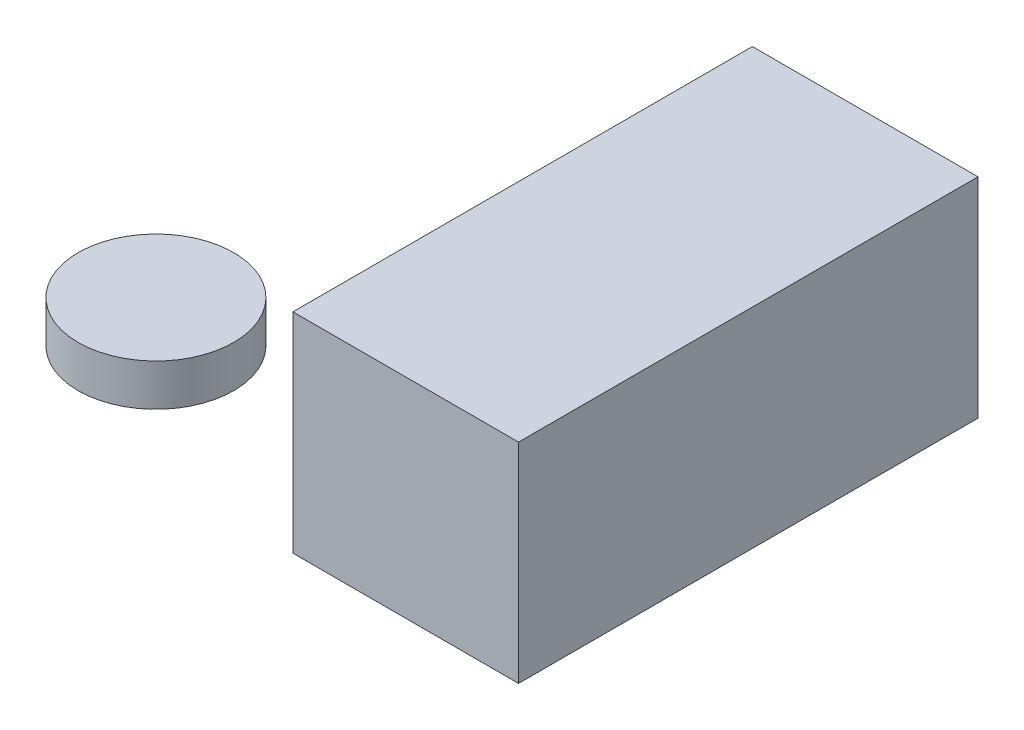
ISO-10303-21;
HEADER;
FILE_DESCRIPTION(('STEP AP214'),'2;1');
FILE_NAME('part.step','',(''),(''),'','','');
FILE_SCHEMA(('AUTOMOTIVE_DESIGN { 1 0 10303 214 1 1 1 1 }'));
ENDSEC;
DATA;
#1=APPLICATION_CONTEXT('core data for automotive mechanical design processes');
#2=APPLICATION_PROTOCOL_DEFINITION('international standard','automotive_design',2000,#1);
#3=PRODUCT_CONTEXT('',#1,'mechanical');
#4=PRODUCT('Part','Part','',(#3));
#5=PRODUCT_RELATED_PRODUCT_CATEGORY('part','',(#4));
#6=PRODUCT_DEFINITION_FORMATION('','',#4);
#7=PRODUCT_DEFINITION_CONTEXT('part definition',#1,'design');
#8=PRODUCT_DEFINITION('design','',#6,#7);
#9=PRODUCT_DEFINITION_SHAPE('','',#8);
#10=(LENGTH_UNIT() NAMED_UNIT(*) SI_UNIT(.MILLI.,.METRE.));
#11=(NAMED_UNIT(*) PLANE_ANGLE_UNIT() SI_UNIT($,.RADIAN.));
#12=(NAMED_UNIT(*) SI_UNIT($,.STERADIAN.) SOLID_ANGLE_UNIT());
#13=UNCERTAINTY_MEASURE_WITH_UNIT(LENGTH_MEASURE(1.E-05),#10,'distance_accuracy_value','');
#14=(GEOMETRIC_REPRESENTATION_CONTEXT(3) GLOBAL_UNCERTAINTY_ASSIGNED_CONTEXT((#13)) GLOBAL_UNIT_ASSIGNED_CONTEXT((#10,
#11,#12)) REPRESENTATION_CONTEXT('',''));
#15=CARTESIAN_POINT('',(0.,0.,0.));
#16=DIRECTION('',(0.,0.,1.));
#17=DIRECTION('',(1.,0.,0.));
#18=AXIS2_PLACEMENT_3D('',#15,#16,#17);
#19=CARTESIAN_POINT('',(-86.3368433832069,10.,28.3773931689706));
#20=DIRECTION('',(0.,-1.,0.));
#21=DIRECTION('',(0.,0.,-1.));
#22=AXIS2_PLACEMENT_3D('',#19,#20,#21);
#23=CYLINDRICAL_SURFACE('',#22,18.6142975154497);
#24=CARTESIAN_POINT('',(-86.3368433832069,10.,28.3773931689706));
#25=DIRECTION('',(0.,1.,0.));
#26=DIRECTION('',(0.,0.,1.));
#27=AXIS2_PLACEMENT_3D('',#24,#25,#26);
#28=CIRCLE('',#27,18.6142975154497);
#29=CARTESIAN_POINT('',(-86.3368433832069,10.,46.9916906844203));
#30=VERTEX_POINT('',#29);
#31=EDGE_CURVE('E11',#30,#30,#28,.T.);
#32=ORIENTED_EDGE('',*,*,#31,.F.);
#33=EDGE_LOOP('',(#32));
#34=FACE_BOUND('',#33,.T.);
#35=CARTESIAN_POINT('',(-86.3368433832069,0.,28.3773931689706));
#36=DIRECTION('',(0.,1.,0.));
#37=DIRECTION('',(0.,0.,1.));
#38=AXIS2_PLACEMENT_3D('',#35,#36,#37);
#39=CIRCLE('',#38,18.6142975154497);
#40=CARTESIAN_POINT('',(-86.3368433832069,0.,46.9916906844203));
#41=VERTEX_POINT('',#40);
#42=EDGE_CURVE('E51',#41,#41,#39,.T.);
#43=ORIENTED_EDGE('',*,*,#42,.T.);
#44=EDGE_LOOP('',(#43));
#45=FACE_BOUND('',#44,.T.);
#46=ADVANCED_FACE('F48',(#34,#45),#23,.T.);
#47=CARTESIAN_POINT('',(-86.3368433832069,10.,28.3773931689706));
#48=DIRECTION('',(0.,1.,0.));
#49=DIRECTION('',(0.,0.,1.));
#50=AXIS2_PLACEMENT_3D('',#47,#48,#49);
#51=PLANE('',#50);
#52=ORIENTED_EDGE('',*,*,#31,.T.);
#53=EDGE_LOOP('',(#52));
#54=FACE_BOUND('',#53,.T.);
#55=ADVANCED_FACE('F63',(#54),#51,.T.);
#56=CARTESIAN_POINT('',(-86.3368433832069,0.,28.3773931689706));
#57=DIRECTION('',(0.,1.,0.));
#58=DIRECTION('',(0.,0.,1.));
#59=AXIS2_PLACEMENT_3D('',#56,#57,#58);
#60=PLANE('',#59);
#61=ORIENTED_EDGE('',*,*,#42,.F.);
#62=EDGE_LOOP('',(#61));
#63=FACE_BOUND('',#62,.T.);
#64=ADVANCED_FACE('F61',(#63),#60,.F.);
#65=CLOSED_SHELL('',(#46,#55,#64));
#66=MANIFOLD_SOLID_BREP('B2',#65);
#67=CARTESIAN_POINT('',(-56.9852326353717,10.,0.));
#68=DIRECTION('',(0.,-1.,0.));
#69=DIRECTION('',(0.,0.,-1.));
#70=AXIS2_PLACEMENT_3D('',#67,#68,#69);
#71=CYLINDRICAL_SURFACE('',#70,5.);
#72=CARTESIAN_POINT('',(-56.9852326353717,10.,0.));
#73=DIRECTION('',(0.,1.,0.));
#74=DIRECTION('',(0.,0.,1.));
#75=AXIS2_PLACEMENT_3D('',#72,#73,#74);
#76=CIRCLE('',#75,5.);
#77=CARTESIAN_POINT('',(-56.9852326353717,10.,5.));
#78=VERTEX_POINT('',#77);
#79=EDGE_CURVE('E47',#78,#78,#76,.T.);
#80=ORIENTED_EDGE('',*,*,#79,.F.);
#81=EDGE_LOOP('',(#80));
#82=FACE_BOUND('',#81,.T.);
#83=CARTESIAN_POINT('',(-56.9852326353717,0.,0.));
#84=DIRECTION('',(0.,1.,0.));
#85=DIRECTION('',(0.,0.,1.));
#86=AXIS2_PLACEMENT_3D('',#83,#84,#85);
#87=CIRCLE('',#86,5.);
#88=CARTESIAN_POINT('',(-56.9852326353717,0.,5.));
#89=VERTEX_POINT('',#88);
#90=EDGE_CURVE('E101',#89,#89,#87,.T.);
#91=ORIENTED_EDGE('',*,*,#90,.T.);
#92=EDGE_LOOP('',(#91));
#93=FACE_BOUND('',#92,.T.);
#94=ADVANCED_FACE('F98',(#82,#93),#71,.T.);
#95=CARTESIAN_POINT('',(-56.9852326353717,10.,0.));
#96=DIRECTION('',(0.,1.,0.));
#97=DIRECTION('',(0.,0.,1.));
#98=AXIS2_PLACEMENT_3D('',#95,#96,#97);
#99=PLANE('',#98);
#100=ORIENTED_EDGE('',*,*,#79,.T.);
#101=EDGE_LOOP('',(#100));
#102=FACE_BOUND('',#101,.T.);
#103=ADVANCED_FACE('F113',(#102),#99,.T.);
#104=CARTESIAN_POINT('',(-56.9852326353717,0.,0.));
#105=DIRECTION('',(0.,1.,0.));
#106=DIRECTION('',(0.,0.,1.));
#107=AXIS2_PLACEMENT_3D('',#104,#105,#106);
#108=PLANE('',#107);
#109=ORIENTED_EDGE('',*,*,#90,.F.);
#110=EDGE_LOOP('',(#109));
#111=FACE_BOUND('',#110,.T.);
#112=ADVANCED_FACE('F111',(#111),#108,.F.);
#113=CLOSED_SHELL('',(#94,#103,#112));
#114=MANIFOLD_SOLID_BREP('B6',#113);
#115=CARTESIAN_POINT('',(26.9852326353717,50.,54.956563421413));
#116=DIRECTION('',(-1.,0.,0.));
#117=DIRECTION('',(0.,0.,1.));
#118=AXIS2_PLACEMENT_3D('',#115,#116,#117);
#119=PLANE('',#118);
#120=DIRECTION('',(0.,0.,-1.));
#121=VECTOR('',#120,1.);
#122=CARTESIAN_POINT('',(26.9852326353717,0.,54.956563421413));
#123=LINE('',#122,#121);
#124=CARTESIAN_POINT('',(26.9852326353717,0.,54.956563421413));
#125=VERTEX_POINT('',#124);
#126=CARTESIAN_POINT('',(26.9852326353717,0.,-54.956563421413));
#127=VERTEX_POINT('',#126);
#128=EDGE_CURVE('E210',#125,#127,#123,.T.);
#129=ORIENTED_EDGE('',*,*,#128,.T.);
#130=DIRECTION('',(0.,-1.,0.));
#131=VECTOR('',#130,1.);
#132=CARTESIAN_POINT('',(26.9852326353717,50.,-54.956563421413));
#133=LINE('',#132,#131);
#134=CARTESIAN_POINT('',(26.9852326353717,50.,-54.956563421413));
#135=VERTEX_POINT('',#134);
#136=EDGE_CURVE('E96',#135,#127,#133,.T.);
#137=ORIENTED_EDGE('',*,*,#136,.F.);
#138=DIRECTION('',(0.,0.,-1.));
#139=VECTOR('',#138,1.);
#140=CARTESIAN_POINT('',(26.9852326353717,50.,54.956563421413));
#141=LINE('',#140,#139);
#142=CARTESIAN_POINT('',(26.9852326353717,50.,54.956563421413));
#143=VERTEX_POINT('',#142);
#144=EDGE_CURVE('E198',#143,#135,#141,.T.);
#145=ORIENTED_EDGE('',*,*,#144,.F.);
#146=DIRECTION('',(0.,-1.,0.));
#147=VECTOR('',#146,1.);
#148=CARTESIAN_POINT('',(26.9852326353717,50.,54.956563421413));
#149=LINE('',#148,#147);
#150=EDGE_CURVE('E206',#143,#125,#149,.T.);
#151=ORIENTED_EDGE('',*,*,#150,.T.);
#152=EDGE_LOOP('',(#129,#137,#145,#151));
#153=FACE_BOUND('',#152,.T.);
#154=ADVANCED_FACE('F147',(#153),#119,.F.);
#155=CARTESIAN_POINT('',(-26.9852326353717,50.,-54.956563421413));
#156=DIRECTION('',(0.,0.,1.));
#157=DIRECTION('',(1.,0.,0.));
#158=AXIS2_PLACEMENT_3D('',#155,#156,#157);
#159=PLANE('',#158);
#160=DIRECTION('',(-1.,0.,0.));
#161=VECTOR('',#160,1.);
#162=CARTESIAN_POINT('',(-26.9852326353717,0.,-54.956563421413));
#163=LINE('',#162,#161);
#164=CARTESIAN_POINT('',(-26.9852326353717,0.,-54.956563421413));
#165=VERTEX_POINT('',#164);
#166=EDGE_CURVE('E202',#127,#165,#163,.T.);
#167=ORIENTED_EDGE('',*,*,#166,.T.);
#168=DIRECTION('',(0.,-1.,0.));
#169=VECTOR('',#168,1.);
#170=CARTESIAN_POINT('',(-26.9852326353717,50.,-54.956563421413));
#171=LINE('',#170,#169);
#172=CARTESIAN_POINT('',(-26.9852326353717,50.,-54.956563421413));
#173=VERTEX_POINT('',#172);
#174=EDGE_CURVE('E155',#173,#165,#171,.T.);
#175=ORIENTED_EDGE('',*,*,#174,.F.);
#176=DIRECTION('',(-1.,0.,0.));
#177=VECTOR('',#176,1.);
#178=CARTESIAN_POINT('',(-26.9852326353717,50.,-54.956563421413));
#179=LINE('',#178,#177);
#180=EDGE_CURVE('E193',#135,#173,#179,.T.);
#181=ORIENTED_EDGE('',*,*,#180,.F.);
#182=ORIENTED_EDGE('',*,*,#136,.T.);
#183=EDGE_LOOP('',(#167,#175,#181,#182));
#184=FACE_BOUND('',#183,.T.);
#185=ADVANCED_FACE('F201',(#184),#159,.F.);
#186=CARTESIAN_POINT('',(-26.9852326353717,50.,54.956563421413));
#187=DIRECTION('',(1.,0.,0.));
#188=DIRECTION('',(0.,0.,-1.));
#189=AXIS2_PLACEMENT_3D('',#186,#187,#188);
#190=PLANE('',#189);
#191=DIRECTION('',(0.,0.,1.));
#192=VECTOR('',#191,1.);
#193=CARTESIAN_POINT('',(-26.9852326353717,0.,54.956563421413));
#194=LINE('',#193,#192);
#195=CARTESIAN_POINT('',(-26.9852326353717,0.,54.956563421413));
#196=VERTEX_POINT('',#195);
#197=EDGE_CURVE('E180',#165,#196,#194,.T.);
#198=ORIENTED_EDGE('',*,*,#197,.T.);
#199=DIRECTION('',(0.,-1.,0.));
#200=VECTOR('',#199,1.);
#201=CARTESIAN_POINT('',(-26.9852326353717,50.,54.956563421413));
#202=LINE('',#201,#200);
#203=CARTESIAN_POINT('',(-26.9852326353717,50.,54.956563421413));
#204=VERTEX_POINT('',#203);
#205=EDGE_CURVE('E203',#204,#196,#202,.T.);
#206=ORIENTED_EDGE('',*,*,#205,.F.);
#207=DIRECTION('',(0.,0.,1.));
#208=VECTOR('',#207,1.);
#209=CARTESIAN_POINT('',(-26.9852326353717,50.,54.956563421413));
#210=LINE('',#209,#208);
#211=EDGE_CURVE('E196',#173,#204,#210,.T.);
#212=ORIENTED_EDGE('',*,*,#211,.F.);
#213=ORIENTED_EDGE('',*,*,#174,.T.);
#214=EDGE_LOOP('',(#198,#206,#212,#213));
#215=FACE_BOUND('',#214,.T.);
#216=ADVANCED_FACE('F204',(#215),#190,.F.);
#217=CARTESIAN_POINT('',(-26.9852326353717,50.,54.956563421413));
#218=DIRECTION('',(0.,0.,-1.));
#219=DIRECTION('',(-1.,0.,0.));
#220=AXIS2_PLACEMENT_3D('',#217,#218,#219);
#221=PLANE('',#220);
#222=DIRECTION('',(1.,0.,0.));
#223=VECTOR('',#222,1.);
#224=CARTESIAN_POINT('',(-26.9852326353717,0.,54.956563421413));
#225=LINE('',#224,#223);
#226=EDGE_CURVE('E186',#196,#125,#225,.T.);
#227=ORIENTED_EDGE('',*,*,#226,.T.);
#228=ORIENTED_EDGE('',*,*,#150,.F.);
#229=DIRECTION('',(1.,0.,0.));
#230=VECTOR('',#229,1.);
#231=CARTESIAN_POINT('',(-26.9852326353717,50.,54.956563421413));
#232=LINE('',#231,#230);
#233=EDGE_CURVE('E163',#204,#143,#232,.T.);
#234=ORIENTED_EDGE('',*,*,#233,.F.);
#235=ORIENTED_EDGE('',*,*,#205,.T.);
#236=EDGE_LOOP('',(#227,#228,#234,#235));
#237=FACE_BOUND('',#236,.T.);
#238=ADVANCED_FACE('F217',(#237),#221,.F.);
#239=CARTESIAN_POINT('',(0.,50.,0.));
#240=DIRECTION('',(0.,-1.,0.));
#241=DIRECTION('',(0.,0.,-1.));
#242=AXIS2_PLACEMENT_3D('',#239,#240,#241);
#243=PLANE('',#242);
#244=ORIENTED_EDGE('',*,*,#144,.T.);
#245=ORIENTED_EDGE('',*,*,#180,.T.);
#246=ORIENTED_EDGE('',*,*,#211,.T.);
#247=ORIENTED_EDGE('',*,*,#233,.T.);
#248=EDGE_LOOP('',(#244,#245,#246,#247));
#249=FACE_BOUND('',#248,.T.);
#250=ADVANCED_FACE('F194',(#249),#243,.F.);
#251=CARTESIAN_POINT('',(0.,0.,0.));
#252=DIRECTION('',(0.,-1.,0.));
#253=DIRECTION('',(0.,0.,-1.));
#254=AXIS2_PLACEMENT_3D('',#251,#252,#253);
#255=PLANE('',#254);
#256=ORIENTED_EDGE('',*,*,#128,.F.);
#257=ORIENTED_EDGE('',*,*,#226,.F.);
#258=ORIENTED_EDGE('',*,*,#197,.F.);
#259=ORIENTED_EDGE('',*,*,#166,.F.);
#260=EDGE_LOOP('',(#256,#257,#258,#259));
#261=FACE_BOUND('',#260,.T.);
#262=ADVANCED_FACE('F220',(#261),#255,.T.);
#263=CLOSED_SHELL('',(#154,#185,#216,#238,#250,#262));
#264=MANIFOLD_SOLID_BREP('B42',#263);
#265=ADVANCED_BREP_SHAPE_REPRESENTATION('',(#18,#66,#114,#264),#14);
#266=SHAPE_DEFINITION_REPRESENTATION(#9,#265);
ENDSEC;
END-ISO-10303-21;
